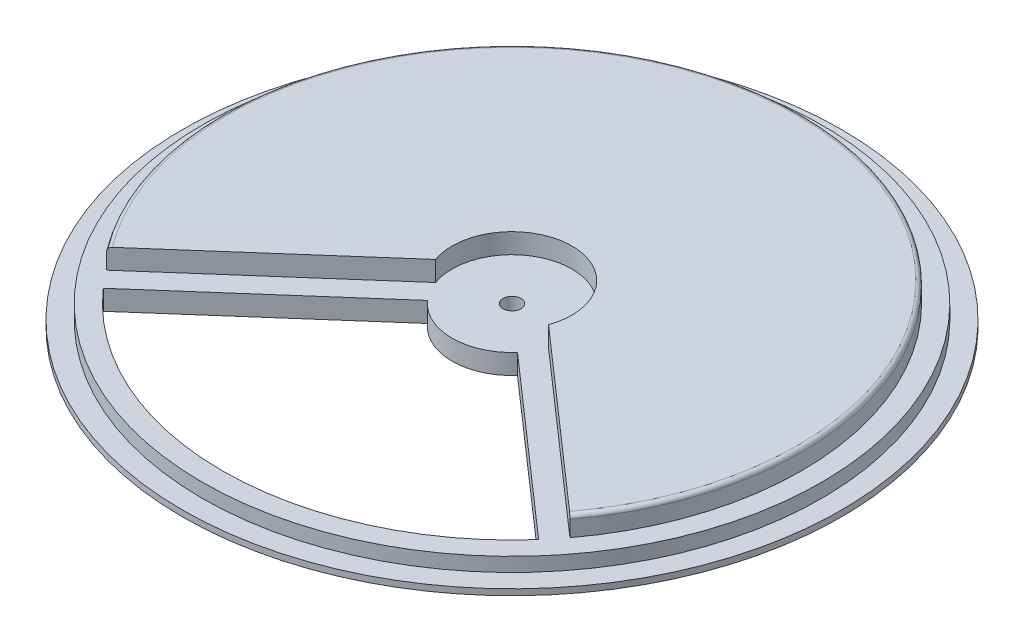
ISO-10303-21;
HEADER;
FILE_DESCRIPTION(('STEP AP214'),'2;1');
FILE_NAME('part.step','',(''),(''),'','','');
FILE_SCHEMA(('AUTOMOTIVE_DESIGN { 1 0 10303 214 1 1 1 1 }'));
ENDSEC;
DATA;
#1=APPLICATION_CONTEXT('core data for automotive mechanical design processes');
#2=APPLICATION_PROTOCOL_DEFINITION('international standard','automotive_design',2000,#1);
#3=PRODUCT_CONTEXT('',#1,'mechanical');
#4=PRODUCT('Part','Part','',(#3));
#5=PRODUCT_RELATED_PRODUCT_CATEGORY('part','',(#4));
#6=PRODUCT_DEFINITION_FORMATION('','',#4);
#7=PRODUCT_DEFINITION_CONTEXT('part definition',#1,'design');
#8=PRODUCT_DEFINITION('design','',#6,#7);
#9=PRODUCT_DEFINITION_SHAPE('','',#8);
#10=(LENGTH_UNIT() NAMED_UNIT(*) SI_UNIT(.MILLI.,.METRE.));
#11=(NAMED_UNIT(*) PLANE_ANGLE_UNIT() SI_UNIT($,.RADIAN.));
#12=(NAMED_UNIT(*) SI_UNIT($,.STERADIAN.) SOLID_ANGLE_UNIT());
#13=UNCERTAINTY_MEASURE_WITH_UNIT(LENGTH_MEASURE(1.E-05),#10,'distance_accuracy_value','');
#14=(GEOMETRIC_REPRESENTATION_CONTEXT(3) GLOBAL_UNCERTAINTY_ASSIGNED_CONTEXT((#13)) GLOBAL_UNIT_ASSIGNED_CONTEXT((#10,
#11,#12)) REPRESENTATION_CONTEXT('',''));
#15=CARTESIAN_POINT('',(0.,0.,0.));
#16=DIRECTION('',(0.,0.,1.));
#17=DIRECTION('',(1.,0.,0.));
#18=AXIS2_PLACEMENT_3D('',#15,#16,#17);
#19=CARTESIAN_POINT('',(0.,3.81,0.));
#20=DIRECTION('',(0.,-1.,0.));
#21=DIRECTION('',(0.,0.,-1.));
#22=AXIS2_PLACEMENT_3D('',#19,#20,#21);
#23=CYLINDRICAL_SURFACE('',#22,209.55);
#24=CARTESIAN_POINT('',(0.,3.81,0.));
#25=DIRECTION('',(0.,1.,0.));
#26=DIRECTION('',(0.,0.,1.));
#27=AXIS2_PLACEMENT_3D('',#24,#25,#26);
#28=CIRCLE('',#27,209.55);
#29=CARTESIAN_POINT('',(0.,3.81,-209.55));
#30=VERTEX_POINT('',#29);
#31=EDGE_CURVE('E115',#30,#30,#28,.T.);
#32=CARTESIAN_POINT('',(0.,0.,0.));
#33=DIRECTION('',(0.,1.,0.));
#34=DIRECTION('',(0.,0.,1.));
#35=AXIS2_PLACEMENT_3D('',#32,#33,#34);
#36=CIRCLE('',#35,209.55);
#37=CARTESIAN_POINT('',(0.,0.,-209.55));
#38=VERTEX_POINT('',#37);
#39=EDGE_CURVE('E373',#38,#38,#36,.T.);
#40=CARTESIAN_POINT('',(0.,3.81,-209.55));
#41=CARTESIAN_POINT('',(0.,3.7703125,-209.55));
#42=CARTESIAN_POINT('',(0.,3.730625,-209.55));
#43=CARTESIAN_POINT('',(0.,3.65125,-209.55));
#44=CARTESIAN_POINT('',(0.,3.6115625,-209.55));
#45=CARTESIAN_POINT('',(0.,3.5321875,-209.55));
#46=CARTESIAN_POINT('',(0.,3.4925,-209.55));
#47=CARTESIAN_POINT('',(0.,3.413125,-209.55));
#48=CARTESIAN_POINT('',(0.,3.3734375,-209.55));
#49=CARTESIAN_POINT('',(0.,3.2940625,-209.55));
#50=CARTESIAN_POINT('',(0.,3.254375,-209.55));
#51=CARTESIAN_POINT('',(0.,3.175,-209.55));
#52=CARTESIAN_POINT('',(0.,3.1353125,-209.55));
#53=CARTESIAN_POINT('',(0.,3.0559375,-209.55));
#54=CARTESIAN_POINT('',(0.,3.01625,-209.55));
#55=CARTESIAN_POINT('',(0.,2.936875,-209.55));
#56=CARTESIAN_POINT('',(0.,2.8971875,-209.55));
#57=CARTESIAN_POINT('',(0.,2.8178125,-209.55));
#58=CARTESIAN_POINT('',(0.,2.778125,-209.55));
#59=CARTESIAN_POINT('',(0.,2.69875,-209.55));
#60=CARTESIAN_POINT('',(0.,2.6590625,-209.55));
#61=CARTESIAN_POINT('',(0.,2.5796875,-209.55));
#62=CARTESIAN_POINT('',(0.,2.54,-209.55));
#63=CARTESIAN_POINT('',(0.,2.460625,-209.55));
#64=CARTESIAN_POINT('',(0.,2.4209375,-209.55));
#65=CARTESIAN_POINT('',(0.,2.3415625,-209.55));
#66=CARTESIAN_POINT('',(0.,2.301875,-209.55));
#67=CARTESIAN_POINT('',(0.,2.2225,-209.55));
#68=CARTESIAN_POINT('',(0.,2.1828125,-209.55));
#69=CARTESIAN_POINT('',(0.,2.1034375,-209.55));
#70=CARTESIAN_POINT('',(0.,2.06375,-209.55));
#71=CARTESIAN_POINT('',(0.,1.984375,-209.55));
#72=CARTESIAN_POINT('',(0.,1.9446875,-209.55));
#73=CARTESIAN_POINT('',(0.,1.8653125,-209.55));
#74=CARTESIAN_POINT('',(0.,1.825625,-209.55));
#75=CARTESIAN_POINT('',(0.,1.74625,-209.55));
#76=CARTESIAN_POINT('',(0.,1.7065625,-209.55));
#77=CARTESIAN_POINT('',(0.,1.6271875,-209.55));
#78=CARTESIAN_POINT('',(0.,1.5875,-209.55));
#79=CARTESIAN_POINT('',(0.,1.508125,-209.55));
#80=CARTESIAN_POINT('',(0.,1.4684375,-209.55));
#81=CARTESIAN_POINT('',(0.,1.3890625,-209.55));
#82=CARTESIAN_POINT('',(0.,1.349375,-209.55));
#83=CARTESIAN_POINT('',(0.,1.27,-209.55));
#84=CARTESIAN_POINT('',(0.,1.2303125,-209.55));
#85=CARTESIAN_POINT('',(0.,1.1509375,-209.55));
#86=CARTESIAN_POINT('',(0.,1.11125,-209.55));
#87=CARTESIAN_POINT('',(0.,1.031875,-209.55));
#88=CARTESIAN_POINT('',(0.,0.9921875,-209.55));
#89=CARTESIAN_POINT('',(0.,0.9128125,-209.55));
#90=CARTESIAN_POINT('',(0.,0.873125,-209.55));
#91=CARTESIAN_POINT('',(0.,0.79375,-209.55));
#92=CARTESIAN_POINT('',(0.,0.7540625,-209.55));
#93=CARTESIAN_POINT('',(0.,0.6746875,-209.55));
#94=CARTESIAN_POINT('',(0.,0.635,-209.55));
#95=CARTESIAN_POINT('',(0.,0.555625,-209.55));
#96=CARTESIAN_POINT('',(0.,0.5159375,-209.55));
#97=CARTESIAN_POINT('',(0.,0.4365625,-209.55));
#98=CARTESIAN_POINT('',(0.,0.396875,-209.55));
#99=CARTESIAN_POINT('',(0.,0.3175,-209.55));
#100=CARTESIAN_POINT('',(0.,0.2778125,-209.55));
#101=CARTESIAN_POINT('',(0.,0.1984375,-209.55));
#102=CARTESIAN_POINT('',(0.,0.15875,-209.55));
#103=CARTESIAN_POINT('',(0.,0.0793749999999999,-209.55));
#104=CARTESIAN_POINT('',(0.,0.0396874999999999,-209.55));
#105=CARTESIAN_POINT('',(0.,0.,-209.55));
#106=B_SPLINE_CURVE_WITH_KNOTS('',3,(#40,#41,#42,#43,#44,#45,#46,#47,#48,#49,#50,#51,#52,#53,
#54,#55,#56,#57,#58,#59,#60,#61,#62,#63,#64,#65,#66,#67,#68,#69,#70,#71,#72,#73,#74,#75,#76,#77,
#78,#79,#80,#81,#82,#83,#84,#85,#86,#87,#88,#89,#90,#91,#92,#93,#94,#95,#96,#97,#98,#99,#100,
#101,#102,#103,#104,#105),.UNSPECIFIED.,.F.,.F.,(4,2,2,2,2,2,2,2,2,2,2,2,2,2,2,2,2,2,2,2,2,2,2,
2,2,2,2,2,2,2,2,2,4),(0.,0.1190625,0.238125,0.3571875,0.47625,0.5953125,0.714375,0.8334375,
0.9525,1.0715625,1.190625,1.3096875,1.42875,1.5478125,1.666875,1.7859375,1.905,2.0240625,
2.143125,2.2621875,2.38125,2.5003125,2.619375,2.7384375,2.8575,2.9765625,3.095625,3.2146875,
3.33375,3.4528125,3.571875,3.6909375,3.81),.UNSPECIFIED.);
#107=EDGE_CURVE('BSEAM52',#30,#38,#106,.T.);
#108=ORIENTED_EDGE('',*,*,#31,.F.);
#109=ORIENTED_EDGE('',*,*,#39,.T.);
#110=ORIENTED_EDGE('',*,*,#107,.T.);
#111=ORIENTED_EDGE('',*,*,#107,.F.);
#112=EDGE_LOOP('',(#108,#110,#109,#111));
#113=FACE_BOUND('',#112,.T.);
#114=ADVANCED_FACE('F52',(#113),#23,.T.);
#115=CARTESIAN_POINT('',(0.,3.81,0.));
#116=DIRECTION('',(0.,1.,0.));
#117=DIRECTION('',(0.,0.,1.));
#118=AXIS2_PLACEMENT_3D('',#115,#116,#117);
#119=PLANE('',#118);
#120=CARTESIAN_POINT('',(0.,3.81,0.));
#121=DIRECTION('',(0.,1.,0.));
#122=DIRECTION('',(0.,0.,1.));
#123=AXIS2_PLACEMENT_3D('',#120,#121,#122);
#124=CIRCLE('',#123,196.85);
#125=CARTESIAN_POINT('',(0.,3.81,196.85));
#126=VERTEX_POINT('',#125);
#127=EDGE_CURVE('E128',#126,#126,#124,.T.);
#128=ORIENTED_EDGE('',*,*,#127,.F.);
#129=EDGE_LOOP('',(#128));
#130=FACE_BOUND('',#129,.T.);
#131=ORIENTED_EDGE('',*,*,#31,.T.);
#132=EDGE_LOOP('',(#131));
#133=FACE_BOUND('',#132,.T.);
#134=ADVANCED_FACE('F219',(#130,#133),#119,.T.);
#135=CARTESIAN_POINT('',(0.,0.,0.));
#136=DIRECTION('',(0.,1.,0.));
#137=DIRECTION('',(0.,0.,1.));
#138=AXIS2_PLACEMENT_3D('',#135,#136,#137);
#139=PLANE('',#138);
#140=DIRECTION('',(-0.751519606456444,0.,0.659710755643374));
#141=VECTOR('',#140,1.);
#142=CARTESIAN_POINT('',(-138.392335528954,0.,121.485735651727));
#143=LINE('',#142,#141);
#144=CARTESIAN_POINT('',(-28.6328970059905,0.,25.1349797900126));
#145=VERTEX_POINT('',#144);
#146=CARTESIAN_POINT('',(-138.392335528954,0.,121.485735651727));
#147=VERTEX_POINT('',#146);
#148=EDGE_CURVE('E92',#145,#147,#143,.T.);
#149=ORIENTED_EDGE('',*,*,#148,.T.);
#150=CARTESIAN_POINT('',(0.,0.,0.));
#151=DIRECTION('',(0.,1.,0.));
#152=DIRECTION('',(0.,0.,1.));
#153=AXIS2_PLACEMENT_3D('',#150,#151,#152);
#154=CIRCLE('',#153,184.15);
#155=CARTESIAN_POINT('',(138.392335528954,0.,121.485735651727));
#156=VERTEX_POINT('',#155);
#157=EDGE_CURVE('E114',#147,#156,#154,.T.);
#158=ORIENTED_EDGE('',*,*,#157,.T.);
#159=DIRECTION('',(-0.751519606456444,0.,-0.659710755643375));
#160=VECTOR('',#159,1.);
#161=CARTESIAN_POINT('',(28.6328970059905,0.,25.1349797900126));
#162=LINE('',#161,#160);
#163=CARTESIAN_POINT('',(28.6328970059905,0.,25.1349797900126));
#164=VERTEX_POINT('',#163);
#165=EDGE_CURVE('E119',#156,#164,#162,.T.);
#166=ORIENTED_EDGE('',*,*,#165,.T.);
#167=CARTESIAN_POINT('',(0.,0.,0.));
#168=DIRECTION('',(0.,-1.,0.));
#169=DIRECTION('',(0.,0.,1.));
#170=AXIS2_PLACEMENT_3D('',#167,#168,#169);
#171=CIRCLE('',#170,38.1);
#172=EDGE_CURVE('E116',#164,#145,#171,.T.);
#173=ORIENTED_EDGE('',*,*,#172,.T.);
#174=EDGE_LOOP('',(#149,#158,#166,#173));
#175=FACE_BOUND('',#174,.T.);
#176=DIRECTION('',(0.751519606456444,0.,0.659710755643374));
#177=VECTOR('',#176,1.);
#178=CARTESIAN_POINT('',(147.32,0.,110.49));
#179=LINE('',#178,#177);
#180=CARTESIAN_POINT('',(35.9210244842766,0.,12.7));
#181=VERTEX_POINT('',#180);
#182=CARTESIAN_POINT('',(147.32,0.,110.49));
#183=VERTEX_POINT('',#182);
#184=EDGE_CURVE('E118',#181,#183,#179,.T.);
#185=ORIENTED_EDGE('',*,*,#184,.T.);
#186=CARTESIAN_POINT('',(0.,0.,0.));
#187=DIRECTION('',(0.,1.,0.));
#188=DIRECTION('',(0.,0.,1.));
#189=AXIS2_PLACEMENT_3D('',#186,#187,#188);
#190=CIRCLE('',#189,184.15);
#191=CARTESIAN_POINT('',(-147.32,0.,110.49));
#192=VERTEX_POINT('',#191);
#193=EDGE_CURVE('E156',#183,#192,#190,.T.);
#194=ORIENTED_EDGE('',*,*,#193,.T.);
#195=DIRECTION('',(0.751519606456444,0.,-0.659710755643374));
#196=VECTOR('',#195,1.);
#197=CARTESIAN_POINT('',(-147.32,0.,110.49));
#198=LINE('',#197,#196);
#199=CARTESIAN_POINT('',(-35.9210244842766,0.,12.7));
#200=VERTEX_POINT('',#199);
#201=EDGE_CURVE('E161',#192,#200,#198,.T.);
#202=ORIENTED_EDGE('',*,*,#201,.T.);
#203=CARTESIAN_POINT('',(0.,0.,0.));
#204=DIRECTION('',(0.,-1.,0.));
#205=DIRECTION('',(0.,0.,1.));
#206=AXIS2_PLACEMENT_3D('',#203,#204,#205);
#207=CIRCLE('',#206,38.1);
#208=EDGE_CURVE('E157',#200,#181,#207,.T.);
#209=ORIENTED_EDGE('',*,*,#208,.T.);
#210=EDGE_LOOP('',(#185,#194,#202,#209));
#211=FACE_BOUND('',#210,.T.);
#212=CARTESIAN_POINT('',(0.,0.,0.));
#213=DIRECTION('',(0.,1.,0.));
#214=DIRECTION('',(0.,0.,1.));
#215=AXIS2_PLACEMENT_3D('',#212,#213,#214);
#216=CIRCLE('',#215,5.715);
#217=CARTESIAN_POINT('',(0.,0.,5.715));
#218=VERTEX_POINT('',#217);
#219=EDGE_CURVE('E160',#218,#218,#216,.T.);
#220=ORIENTED_EDGE('',*,*,#219,.T.);
#221=EDGE_LOOP('',(#220));
#222=FACE_BOUND('',#221,.T.);
#223=ORIENTED_EDGE('',*,*,#39,.F.);
#224=EDGE_LOOP('',(#223));
#225=FACE_BOUND('',#224,.T.);
#226=ADVANCED_FACE('F169',(#175,#211,#222,#225),#139,.F.);
#227=CARTESIAN_POINT('',(0.,12.7,0.));
#228=DIRECTION('',(0.,-1.,0.));
#229=DIRECTION('',(0.,0.,-1.));
#230=AXIS2_PLACEMENT_3D('',#227,#228,#229);
#231=CYLINDRICAL_SURFACE('',#230,196.85);
#232=CARTESIAN_POINT('',(0.,12.7,0.));
#233=DIRECTION('',(0.,1.,0.));
#234=DIRECTION('',(0.,0.,1.));
#235=AXIS2_PLACEMENT_3D('',#232,#233,#234);
#236=CIRCLE('',#235,196.85);
#237=CARTESIAN_POINT('',(0.,12.7,196.85));
#238=VERTEX_POINT('',#237);
#239=EDGE_CURVE('E130',#238,#238,#236,.T.);
#240=ORIENTED_EDGE('',*,*,#239,.F.);
#241=EDGE_LOOP('',(#240));
#242=FACE_BOUND('',#241,.T.);
#243=ORIENTED_EDGE('',*,*,#127,.T.);
#244=EDGE_LOOP('',(#243));
#245=FACE_BOUND('',#244,.T.);
#246=ADVANCED_FACE('F231',(#242,#245),#231,.T.);
#247=CARTESIAN_POINT('',(0.,12.7,0.));
#248=DIRECTION('',(0.,1.,0.));
#249=DIRECTION('',(0.,0.,1.));
#250=AXIS2_PLACEMENT_3D('',#247,#248,#249);
#251=PLANE('',#250);
#252=CARTESIAN_POINT('',(0.,12.7,0.));
#253=DIRECTION('',(0.,1.,0.));
#254=DIRECTION('',(0.,0.,1.));
#255=AXIS2_PLACEMENT_3D('',#252,#253,#254);
#256=CIRCLE('',#255,184.15);
#257=CARTESIAN_POINT('',(-138.392335528954,12.7,121.485735651727));
#258=VERTEX_POINT('',#257);
#259=CARTESIAN_POINT('',(138.392335528954,12.7,121.485735651727));
#260=VERTEX_POINT('',#259);
#261=EDGE_CURVE('E104',#258,#260,#256,.T.);
#262=ORIENTED_EDGE('',*,*,#261,.F.);
#263=DIRECTION('',(-0.751519606456444,0.,0.659710755643374));
#264=VECTOR('',#263,1.);
#265=CARTESIAN_POINT('',(-138.392335528954,12.7,121.485735651727));
#266=LINE('',#265,#264);
#267=CARTESIAN_POINT('',(-28.6328970059905,12.7,25.1349797900126));
#268=VERTEX_POINT('',#267);
#269=EDGE_CURVE('E89',#268,#258,#266,.T.);
#270=ORIENTED_EDGE('',*,*,#269,.F.);
#271=CARTESIAN_POINT('',(0.,12.7,0.));
#272=DIRECTION('',(0.,-1.,0.));
#273=DIRECTION('',(0.,0.,1.));
#274=AXIS2_PLACEMENT_3D('',#271,#272,#273);
#275=CIRCLE('',#274,38.1);
#276=CARTESIAN_POINT('',(28.6328970059905,12.7,25.1349797900126));
#277=VERTEX_POINT('',#276);
#278=EDGE_CURVE('E94',#277,#268,#275,.T.);
#279=ORIENTED_EDGE('',*,*,#278,.F.);
#280=DIRECTION('',(-0.751519606456444,0.,-0.659710755643375));
#281=VECTOR('',#280,1.);
#282=CARTESIAN_POINT('',(28.6328970059905,12.7,25.1349797900126));
#283=LINE('',#282,#281);
#284=EDGE_CURVE('E62',#260,#277,#283,.T.);
#285=ORIENTED_EDGE('',*,*,#284,.F.);
#286=EDGE_LOOP('',(#262,#270,#279,#285));
#287=FACE_BOUND('',#286,.T.);
#288=CARTESIAN_POINT('',(0.,12.7,0.));
#289=DIRECTION('',(0.,1.,0.));
#290=DIRECTION('',(0.,0.,1.));
#291=AXIS2_PLACEMENT_3D('',#288,#289,#290);
#292=CIRCLE('',#291,184.15);
#293=CARTESIAN_POINT('',(147.32,12.7,110.49));
#294=VERTEX_POINT('',#293);
#295=CARTESIAN_POINT('',(-147.32,12.7,110.49));
#296=VERTEX_POINT('',#295);
#297=EDGE_CURVE('E56',#294,#296,#292,.T.);
#298=ORIENTED_EDGE('',*,*,#297,.F.);
#299=DIRECTION('',(-0.751519606456444,0.,-0.659710755643374));
#300=VECTOR('',#299,1.);
#301=CARTESIAN_POINT('',(147.32,12.7,110.49));
#302=LINE('',#301,#300);
#303=CARTESIAN_POINT('',(35.9210244842766,12.7,12.7));
#304=VERTEX_POINT('',#303);
#305=EDGE_CURVE('E124',#294,#304,#302,.T.);
#306=ORIENTED_EDGE('',*,*,#305,.T.);
#307=CARTESIAN_POINT('',(0.,12.7,0.));
#308=DIRECTION('',(0.,1.,0.));
#309=DIRECTION('',(0.,0.,1.));
#310=AXIS2_PLACEMENT_3D('',#307,#308,#309);
#311=CIRCLE('',#310,38.1);
#312=CARTESIAN_POINT('',(-35.9210244842766,12.7,12.7));
#313=VERTEX_POINT('',#312);
#314=EDGE_CURVE('E127',#304,#313,#311,.T.);
#315=ORIENTED_EDGE('',*,*,#314,.T.);
#316=DIRECTION('',(0.751519606456444,0.,-0.659710755643374));
#317=VECTOR('',#316,1.);
#318=CARTESIAN_POINT('',(-147.32,12.7,110.49));
#319=LINE('',#318,#317);
#320=EDGE_CURVE('E131',#296,#313,#319,.T.);
#321=ORIENTED_EDGE('',*,*,#320,.F.);
#322=EDGE_LOOP('',(#298,#306,#315,#321));
#323=FACE_BOUND('',#322,.T.);
#324=CARTESIAN_POINT('',(0.,12.7,0.));
#325=DIRECTION('',(0.,1.,0.));
#326=DIRECTION('',(0.,0.,1.));
#327=AXIS2_PLACEMENT_3D('',#324,#325,#326);
#328=CIRCLE('',#327,5.715);
#329=CARTESIAN_POINT('',(0.,12.7,5.715));
#330=VERTEX_POINT('',#329);
#331=EDGE_CURVE('E148',#330,#330,#328,.T.);
#332=ORIENTED_EDGE('',*,*,#331,.F.);
#333=EDGE_LOOP('',(#332));
#334=FACE_BOUND('',#333,.T.);
#335=ORIENTED_EDGE('',*,*,#239,.T.);
#336=EDGE_LOOP('',(#335));
#337=FACE_BOUND('',#336,.T.);
#338=ADVANCED_FACE('F101',(#287,#323,#334,#337),#251,.T.);
#339=CARTESIAN_POINT('',(0.,0.,0.));
#340=DIRECTION('',(0.,1.,0.));
#341=DIRECTION('',(0.,0.,1.));
#342=AXIS2_PLACEMENT_3D('',#339,#340,#341);
#343=CYLINDRICAL_SURFACE('',#342,5.715);
#344=ORIENTED_EDGE('',*,*,#219,.F.);
#345=EDGE_LOOP('',(#344));
#346=FACE_BOUND('',#345,.T.);
#347=ORIENTED_EDGE('',*,*,#331,.T.);
#348=EDGE_LOOP('',(#347));
#349=FACE_BOUND('',#348,.T.);
#350=ADVANCED_FACE('F207',(#346,#349),#343,.F.);
#351=CARTESIAN_POINT('',(147.32,0.,110.49));
#352=DIRECTION('',(-0.659710755643374,0.,0.751519606456444));
#353=DIRECTION('',(0.751519606456444,0.,0.659710755643374));
#354=AXIS2_PLACEMENT_3D('',#351,#352,#353);
#355=PLANE('',#354);
#356=ORIENTED_EDGE('',*,*,#305,.F.);
#357=DIRECTION('',(0.,1.,0.));
#358=VECTOR('',#357,1.);
#359=CARTESIAN_POINT('',(147.32,0.,110.49));
#360=LINE('',#359,#358);
#361=EDGE_CURVE('E112',#183,#294,#360,.T.);
#362=ORIENTED_EDGE('',*,*,#361,.F.);
#363=ORIENTED_EDGE('',*,*,#184,.F.);
#364=DIRECTION('',(0.,1.,0.));
#365=VECTOR('',#364,1.);
#366=CARTESIAN_POINT('',(35.9210244842766,0.,12.7));
#367=LINE('',#366,#365);
#368=EDGE_CURVE('E142',#181,#304,#367,.T.);
#369=ORIENTED_EDGE('',*,*,#368,.T.);
#370=EDGE_LOOP('',(#356,#362,#363,#369));
#371=FACE_BOUND('',#370,.T.);
#372=ADVANCED_FACE('F205',(#371),#355,.F.);
#373=CARTESIAN_POINT('',(0.,0.,0.));
#374=DIRECTION('',(0.,1.,0.));
#375=DIRECTION('',(0.,0.,1.));
#376=AXIS2_PLACEMENT_3D('',#373,#374,#375);
#377=CYLINDRICAL_SURFACE('',#376,38.1);
#378=ORIENTED_EDGE('',*,*,#314,.F.);
#379=ORIENTED_EDGE('',*,*,#368,.F.);
#380=ORIENTED_EDGE('',*,*,#208,.F.);
#381=DIRECTION('',(0.,1.,0.));
#382=VECTOR('',#381,1.);
#383=CARTESIAN_POINT('',(-35.9210244842766,0.,12.7));
#384=LINE('',#383,#382);
#385=EDGE_CURVE('E134',#200,#313,#384,.T.);
#386=ORIENTED_EDGE('',*,*,#385,.T.);
#387=EDGE_LOOP('',(#378,#379,#380,#386));
#388=FACE_BOUND('',#387,.T.);
#389=ADVANCED_FACE('F204',(#388),#377,.T.);
#390=CARTESIAN_POINT('',(-147.32,0.,110.49));
#391=DIRECTION('',(0.659710755643374,0.,0.751519606456444));
#392=DIRECTION('',(0.751519606456444,0.,-0.659710755643374));
#393=AXIS2_PLACEMENT_3D('',#390,#391,#392);
#394=PLANE('',#393);
#395=ORIENTED_EDGE('',*,*,#320,.T.);
#396=ORIENTED_EDGE('',*,*,#385,.F.);
#397=ORIENTED_EDGE('',*,*,#201,.F.);
#398=DIRECTION('',(0.,1.,0.));
#399=VECTOR('',#398,1.);
#400=CARTESIAN_POINT('',(-147.32,0.,110.49));
#401=LINE('',#400,#399);
#402=EDGE_CURVE('E133',#192,#296,#401,.T.);
#403=ORIENTED_EDGE('',*,*,#402,.T.);
#404=EDGE_LOOP('',(#395,#396,#397,#403));
#405=FACE_BOUND('',#404,.T.);
#406=ADVANCED_FACE('F202',(#405),#394,.F.);
#407=CARTESIAN_POINT('',(0.,0.,0.));
#408=DIRECTION('',(0.,1.,0.));
#409=DIRECTION('',(0.,0.,1.));
#410=AXIS2_PLACEMENT_3D('',#407,#408,#409);
#411=CYLINDRICAL_SURFACE('',#410,184.15);
#412=ORIENTED_EDGE('',*,*,#297,.T.);
#413=ORIENTED_EDGE('',*,*,#402,.F.);
#414=ORIENTED_EDGE('',*,*,#193,.F.);
#415=ORIENTED_EDGE('',*,*,#361,.T.);
#416=EDGE_LOOP('',(#412,#413,#414,#415));
#417=FACE_BOUND('',#416,.T.);
#418=ADVANCED_FACE('F181',(#417),#411,.F.);
#419=CARTESIAN_POINT('',(0.,0.,0.));
#420=DIRECTION('',(0.,1.,0.));
#421=DIRECTION('',(0.,0.,1.));
#422=AXIS2_PLACEMENT_3D('',#419,#420,#421);
#423=CYLINDRICAL_SURFACE('',#422,184.15);
#424=ORIENTED_EDGE('',*,*,#261,.T.);
#425=DIRECTION('',(0.,1.,0.));
#426=VECTOR('',#425,1.);
#427=CARTESIAN_POINT('',(138.392335528954,0.,121.485735651727));
#428=LINE('',#427,#426);
#429=EDGE_CURVE('E12',#156,#260,#428,.T.);
#430=ORIENTED_EDGE('',*,*,#429,.F.);
#431=ORIENTED_EDGE('',*,*,#157,.F.);
#432=DIRECTION('',(0.,1.,0.));
#433=VECTOR('',#432,1.);
#434=CARTESIAN_POINT('',(-138.392335528954,0.,121.485735651727));
#435=LINE('',#434,#433);
#436=EDGE_CURVE('E105',#147,#258,#435,.T.);
#437=ORIENTED_EDGE('',*,*,#436,.T.);
#438=EDGE_LOOP('',(#424,#430,#431,#437));
#439=FACE_BOUND('',#438,.T.);
#440=ADVANCED_FACE('F241',(#439),#423,.F.);
#441=CARTESIAN_POINT('',(-138.392335528954,0.,121.485735651727));
#442=DIRECTION('',(-0.659710755643374,0.,-0.751519606456444));
#443=DIRECTION('',(-0.751519606456444,0.,0.659710755643374));
#444=AXIS2_PLACEMENT_3D('',#441,#442,#443);
#445=PLANE('',#444);
#446=ORIENTED_EDGE('',*,*,#269,.T.);
#447=ORIENTED_EDGE('',*,*,#436,.F.);
#448=ORIENTED_EDGE('',*,*,#148,.F.);
#449=DIRECTION('',(0.,1.,0.));
#450=VECTOR('',#449,1.);
#451=CARTESIAN_POINT('',(-28.6328970059905,0.,25.1349797900126));
#452=LINE('',#451,#450);
#453=EDGE_CURVE('E84',#145,#268,#452,.T.);
#454=ORIENTED_EDGE('',*,*,#453,.T.);
#455=EDGE_LOOP('',(#446,#447,#448,#454));
#456=FACE_BOUND('',#455,.T.);
#457=ADVANCED_FACE('F54',(#456),#445,.F.);
#458=CARTESIAN_POINT('',(0.,0.,0.));
#459=DIRECTION('',(0.,1.,0.));
#460=DIRECTION('',(0.,0.,1.));
#461=AXIS2_PLACEMENT_3D('',#458,#459,#460);
#462=CYLINDRICAL_SURFACE('',#461,38.1);
#463=ORIENTED_EDGE('',*,*,#278,.T.);
#464=ORIENTED_EDGE('',*,*,#453,.F.);
#465=ORIENTED_EDGE('',*,*,#172,.F.);
#466=DIRECTION('',(0.,1.,0.));
#467=VECTOR('',#466,1.);
#468=CARTESIAN_POINT('',(28.6328970059905,0.,25.1349797900126));
#469=LINE('',#468,#467);
#470=EDGE_CURVE('E71',#164,#277,#469,.T.);
#471=ORIENTED_EDGE('',*,*,#470,.T.);
#472=EDGE_LOOP('',(#463,#464,#465,#471));
#473=FACE_BOUND('',#472,.T.);
#474=ADVANCED_FACE('F97',(#473),#462,.T.);
#475=CARTESIAN_POINT('',(28.6328970059905,0.,25.1349797900126));
#476=DIRECTION('',(0.659710755643374,0.,-0.751519606456444));
#477=DIRECTION('',(-0.751519606456444,0.,-0.659710755643375));
#478=AXIS2_PLACEMENT_3D('',#475,#476,#477);
#479=PLANE('',#478);
#480=ORIENTED_EDGE('',*,*,#284,.T.);
#481=ORIENTED_EDGE('',*,*,#470,.F.);
#482=ORIENTED_EDGE('',*,*,#165,.F.);
#483=ORIENTED_EDGE('',*,*,#429,.T.);
#484=EDGE_LOOP('',(#480,#481,#482,#483));
#485=FACE_BOUND('',#484,.T.);
#486=ADVANCED_FACE('F267',(#485),#479,.F.);
#487=CLOSED_SHELL('',(#114,#134,#226,#246,#338,#350,#372,#389,#406,#418,#440,#457,#474,#486));
#488=MANIFOLD_SOLID_BREP('B2',#487);
#489=CARTESIAN_POINT('',(0.,25.4,0.));
#490=DIRECTION('',(0.,1.,0.));
#491=DIRECTION('',(0.,0.,1.));
#492=AXIS2_PLACEMENT_3D('',#489,#490,#491);
#493=PLANE('',#492);
#494=DIRECTION('',(-0.751519606456444,0.,-0.659710755643374));
#495=VECTOR('',#494,1.);
#496=CARTESIAN_POINT('',(147.32,25.4,110.49));
#497=LINE('',#496,#495);
#498=CARTESIAN_POINT('',(145.405397746009,25.4,108.809293749776));
#499=VERTEX_POINT('',#498);
#500=CARTESIAN_POINT('',(35.9210244842766,25.4,12.7));
#501=VERTEX_POINT('',#500);
#502=EDGE_CURVE('E456',#499,#501,#497,.T.);
#503=ORIENTED_EDGE('',*,*,#502,.F.);
#504=CARTESIAN_POINT('',(0.,25.4,0.));
#505=DIRECTION('',(0.,1.,0.));
#506=DIRECTION('',(0.,0.,1.));
#507=AXIS2_PLACEMENT_3D('',#504,#505,#506);
#508=CIRCLE('',#507,181.61);
#509=CARTESIAN_POINT('',(-145.405397746009,25.4,108.809293749776));
#510=VERTEX_POINT('',#509);
#511=EDGE_CURVE('E464',#499,#510,#508,.T.);
#512=ORIENTED_EDGE('',*,*,#511,.T.);
#513=DIRECTION('',(0.751519606456444,0.,-0.659710755643374));
#514=VECTOR('',#513,1.);
#515=CARTESIAN_POINT('',(-147.32,25.4,110.49));
#516=LINE('',#515,#514);
#517=CARTESIAN_POINT('',(-35.9210244842766,25.4,12.7));
#518=VERTEX_POINT('',#517);
#519=EDGE_CURVE('E461',#510,#518,#516,.T.);
#520=ORIENTED_EDGE('',*,*,#519,.T.);
#521=CARTESIAN_POINT('',(0.,25.4,0.));
#522=DIRECTION('',(0.,1.,0.));
#523=DIRECTION('',(0.,0.,1.));
#524=AXIS2_PLACEMENT_3D('',#521,#522,#523);
#525=CIRCLE('',#524,38.1);
#526=EDGE_CURVE('E506',#501,#518,#525,.T.);
#527=ORIENTED_EDGE('',*,*,#526,.F.);
#528=EDGE_LOOP('',(#503,#512,#520,#527));
#529=FACE_BOUND('',#528,.T.);
#530=ADVANCED_FACE('F381',(#529),#493,.T.);
#531=CARTESIAN_POINT('',(147.32,25.4,110.49));
#532=DIRECTION('',(-0.659710755643374,0.,0.751519606456444));
#533=DIRECTION('',(0.751519606456444,0.,0.659710755643374));
#534=AXIS2_PLACEMENT_3D('',#531,#532,#533);
#535=PLANE('',#534);
#536=DIRECTION('',(0.,-1.,0.));
#537=VECTOR('',#536,1.);
#538=CARTESIAN_POINT('',(147.32,25.4,110.49));
#539=LINE('',#538,#537);
#540=CARTESIAN_POINT('',(147.32,22.86,110.49));
#541=VERTEX_POINT('',#540);
#542=CARTESIAN_POINT('',(147.32,12.7,110.49));
#543=VERTEX_POINT('',#542);
#544=EDGE_CURVE('E452',#541,#543,#539,.T.);
#545=ORIENTED_EDGE('',*,*,#544,.F.);
#546=CARTESIAN_POINT('',(147.32,22.86,110.49));
#547=CARTESIAN_POINT('',(147.32000524362,22.9312874188685,110.490004603037));
#548=CARTESIAN_POINT('',(147.317737932438,23.0025715283599,110.488014276291));
#549=CARTESIAN_POINT('',(147.308698758001,23.1446285536486,110.48007936608));
#550=CARTESIAN_POINT('',(147.301927137087,23.2154014967406,110.474134995353));
#551=CARTESIAN_POINT('',(147.283927439081,23.3558804955181,110.458334217474));
#552=CARTESIAN_POINT('',(147.272703101979,23.4255873957089,110.44848109342));
#553=CARTESIAN_POINT('',(147.245890421347,23.5634780229109,110.424943964584));
#554=CARTESIAN_POINT('',(147.230302126238,23.6316617668128,110.411260002306));
#555=CARTESIAN_POINT('',(147.177120950236,23.8332669737115,110.364575666323));
#556=CARTESIAN_POINT('',(147.133103871122,23.963803774977,110.325935901938));
#557=CARTESIAN_POINT('',(147.029273959883,24.2131149596221,110.234790296935));
#558=CARTESIAN_POINT('',(146.969463539828,24.3318911353619,110.182286573718));
#559=CARTESIAN_POINT('',(146.835652063476,24.5546046627676,110.064822079885));
#560=CARTESIAN_POINT('',(146.761632839295,24.6585227162421,109.999845360852));
#561=CARTESIAN_POINT('',(146.601551194304,24.8484195997271,109.859319974589));
#562=CARTESIAN_POINT('',(146.515486358536,24.9343948238475,109.783769187423));
#563=CARTESIAN_POINT('',(146.33350401228,25.0862175279515,109.624018583272));
#564=CARTESIAN_POINT('',(146.237557788996,25.1520040071158,109.53979356117));
#565=CARTESIAN_POINT('',(146.038760057894,25.2612428490896,109.365281811538));
#566=CARTESIAN_POINT('',(145.935912330753,25.3047073288743,109.274998402821));
#567=CARTESIAN_POINT('',(145.761289340594,25.3575474360027,109.121708104337));
#568=CARTESIAN_POINT('',(145.690591256936,25.3734575993442,109.059646801089));
#569=CARTESIAN_POINT('',(145.548404319049,25.3946827027402,108.934830027941));
#570=CARTESIAN_POINT('',(145.476916729679,25.4000126496465,108.872075668378));
#571=CARTESIAN_POINT('',(145.405397746009,25.4,108.809293749776));
#572=B_SPLINE_CURVE_WITH_KNOTS('',3,(#546,#547,#548,#549,#550,#551,#552,#553,#554,#555,#556,
#557,#558,#559,#560,#561,#562,#563,#564,#565,#566,#567,#568,#569,#570,#571),.UNSPECIFIED.,.F.,
.F.,(4,2,2,2,2,2,2,2,2,2,2,2,4),(0.,0.213792487818644,0.42757347404216,0.641175277180946,
0.854774710454669,1.2817891538627,1.70873841829455,2.13623727603325,2.56382196375504,
2.99268617031985,3.42131733126393,3.70698982916982,3.99225684228715),.UNSPECIFIED.);
#573=EDGE_CURVE('E50',#541,#499,#572,.T.);
#574=ORIENTED_EDGE('',*,*,#573,.T.);
#575=ORIENTED_EDGE('',*,*,#502,.T.);
#576=DIRECTION('',(0.,-1.,0.));
#577=VECTOR('',#576,1.);
#578=CARTESIAN_POINT('',(35.9210244842766,25.4,12.7));
#579=LINE('',#578,#577);
#580=CARTESIAN_POINT('',(35.9210244842766,12.7,12.7));
#581=VERTEX_POINT('',#580);
#582=EDGE_CURVE('E467',#501,#581,#579,.T.);
#583=ORIENTED_EDGE('',*,*,#582,.T.);
#584=DIRECTION('',(-0.751519606456444,0.,-0.659710755643374));
#585=VECTOR('',#584,1.);
#586=CARTESIAN_POINT('',(147.32,12.7,110.49));
#587=LINE('',#586,#585);
#588=EDGE_CURVE('E438',#543,#581,#587,.T.);
#589=ORIENTED_EDGE('',*,*,#588,.F.);
#590=EDGE_LOOP('',(#545,#574,#575,#583,#589));
#591=FACE_BOUND('',#590,.T.);
#592=ADVANCED_FACE('F493',(#591),#535,.T.);
#593=CARTESIAN_POINT('',(0.,25.4,0.));
#594=DIRECTION('',(0.,-1.,0.));
#595=DIRECTION('',(0.,0.,-1.));
#596=AXIS2_PLACEMENT_3D('',#593,#594,#595);
#597=CYLINDRICAL_SURFACE('',#596,38.1);
#598=CARTESIAN_POINT('',(0.,12.7,0.));
#599=DIRECTION('',(0.,1.,0.));
#600=DIRECTION('',(0.,0.,1.));
#601=AXIS2_PLACEMENT_3D('',#598,#599,#600);
#602=CIRCLE('',#601,38.1);
#603=CARTESIAN_POINT('',(-35.9210244842766,12.7,12.7));
#604=VERTEX_POINT('',#603);
#605=EDGE_CURVE('E447',#581,#604,#602,.T.);
#606=ORIENTED_EDGE('',*,*,#605,.F.);
#607=ORIENTED_EDGE('',*,*,#582,.F.);
#608=ORIENTED_EDGE('',*,*,#526,.T.);
#609=DIRECTION('',(0.,-1.,0.));
#610=VECTOR('',#609,1.);
#611=CARTESIAN_POINT('',(-35.9210244842766,25.4,12.7));
#612=LINE('',#611,#610);
#613=EDGE_CURVE('E439',#518,#604,#612,.T.);
#614=ORIENTED_EDGE('',*,*,#613,.T.);
#615=EDGE_LOOP('',(#606,#607,#608,#614));
#616=FACE_BOUND('',#615,.T.);
#617=ADVANCED_FACE('F485',(#616),#597,.F.);
#618=CARTESIAN_POINT('',(-147.32,25.4,110.49));
#619=DIRECTION('',(-0.659710755643374,0.,-0.751519606456444));
#620=DIRECTION('',(-0.751519606456444,0.,0.659710755643374));
#621=AXIS2_PLACEMENT_3D('',#618,#619,#620);
#622=PLANE('',#621);
#623=ORIENTED_EDGE('',*,*,#519,.F.);
#624=CARTESIAN_POINT('',(-145.405397746009,25.4,108.809293749776));
#625=CARTESIAN_POINT('',(-145.459368066718,25.4000067282231,108.856670825173));
#626=CARTESIAN_POINT('',(-145.513336001497,25.3969728163925,108.904045806115));
#627=CARTESIAN_POINT('',(-145.620886699303,25.3848756711878,108.998457650477));
#628=CARTESIAN_POINT('',(-145.674469478237,25.3758126882696,109.04549452786));
#629=CARTESIAN_POINT('',(-145.780838489326,25.3517173979791,109.138869045411));
#630=CARTESIAN_POINT('',(-145.833625229427,25.3366890802012,109.185207131472));
#631=CARTESIAN_POINT('',(-145.938046925708,25.3007829635826,109.276872226523));
#632=CARTESIAN_POINT('',(-145.989681897396,25.2799052435595,109.322199249128));
#633=CARTESIAN_POINT('',(-146.142363756062,25.2086612356762,109.456228838627));
#634=CARTESIAN_POINT('',(-146.241227399292,25.1496750371377,109.543014876171));
#635=CARTESIAN_POINT('',(-146.430020464599,25.0104642875089,109.708744172791));
#636=CARTESIAN_POINT('',(-146.519951682376,24.9302440170714,109.787689008196));
#637=CARTESIAN_POINT('',(-146.688278786051,24.7509210798206,109.935452552628));
#638=CARTESIAN_POINT('',(-146.766690648729,24.6518450116573,110.004285286644));
#639=CARTESIAN_POINT('',(-146.909869719734,24.4375156706493,110.129972989683));
#640=CARTESIAN_POINT('',(-146.974634332686,24.3222593276421,110.186825680395));
#641=CARTESIAN_POINT('',(-147.088477810436,24.0791998257122,110.286761551777));
#642=CARTESIAN_POINT('',(-147.137597775356,23.9514307146902,110.329880811602));
#643=CARTESIAN_POINT('',(-147.218944107397,23.6867398011499,110.401289527647));
#644=CARTESIAN_POINT('',(-147.251181084559,23.5498238081078,110.429588297739));
#645=CARTESIAN_POINT('',(-147.289632934391,23.320024108081,110.463342705063));
#646=CARTESIAN_POINT('',(-147.301013744495,23.2286125222043,110.473333186708));
#647=CARTESIAN_POINT('',(-147.316196113083,23.0448136936629,110.486660812185));
#648=CARTESIAN_POINT('',(-147.32000843896,22.9524280253055,110.490007408021));
#649=CARTESIAN_POINT('',(-147.32,22.86,110.49));
#650=B_SPLINE_CURVE_WITH_KNOTS('',3,(#624,#625,#626,#627,#628,#629,#630,#631,#632,#633,#634,
#635,#636,#637,#638,#639,#640,#641,#642,#643,#644,#645,#646,#647,#648,#649),.UNSPECIFIED.,.F.,
.F.,(4,2,2,2,2,2,2,2,2,2,2,2,4),(0.,0.215374949215142,0.430740952012411,0.645963160836856,
0.861182469795924,1.29146188150835,1.72165461762517,2.15124494739758,2.58091690120628,
3.00945056882954,3.43771460215104,3.71517207655573,3.99223453907985),.UNSPECIFIED.);
#651=CARTESIAN_POINT('',(-147.32,22.86,110.49));
#652=VERTEX_POINT('',#651);
#653=EDGE_CURVE('E410',#510,#652,#650,.T.);
#654=ORIENTED_EDGE('',*,*,#653,.T.);
#655=DIRECTION('',(0.,-1.,0.));
#656=VECTOR('',#655,1.);
#657=CARTESIAN_POINT('',(-147.32,25.4,110.49));
#658=LINE('',#657,#656);
#659=CARTESIAN_POINT('',(-147.32,12.7,110.49));
#660=VERTEX_POINT('',#659);
#661=EDGE_CURVE('E431',#652,#660,#658,.T.);
#662=ORIENTED_EDGE('',*,*,#661,.T.);
#663=DIRECTION('',(0.751519606456444,0.,-0.659710755643374));
#664=VECTOR('',#663,1.);
#665=CARTESIAN_POINT('',(-147.32,12.7,110.49));
#666=LINE('',#665,#664);
#667=EDGE_CURVE('E435',#660,#604,#666,.T.);
#668=ORIENTED_EDGE('',*,*,#667,.T.);
#669=ORIENTED_EDGE('',*,*,#613,.F.);
#670=EDGE_LOOP('',(#623,#654,#662,#668,#669));
#671=FACE_BOUND('',#670,.T.);
#672=ADVANCED_FACE('F433',(#671),#622,.F.);
#673=CARTESIAN_POINT('',(0.,25.4,0.));
#674=DIRECTION('',(0.,-1.,0.));
#675=DIRECTION('',(0.,0.,-1.));
#676=AXIS2_PLACEMENT_3D('',#673,#674,#675);
#677=CYLINDRICAL_SURFACE('',#676,184.15);
#678=ORIENTED_EDGE('',*,*,#661,.F.);
#679=CARTESIAN_POINT('',(0.,22.86,0.));
#680=DIRECTION('',(0.,1.,0.));
#681=DIRECTION('',(0.,0.,1.));
#682=AXIS2_PLACEMENT_3D('',#679,#680,#681);
#683=CIRCLE('',#682,184.15);
#684=EDGE_CURVE('E396',#652,#541,#683,.F.);
#685=ORIENTED_EDGE('',*,*,#684,.T.);
#686=ORIENTED_EDGE('',*,*,#544,.T.);
#687=CARTESIAN_POINT('',(0.,12.7,0.));
#688=DIRECTION('',(0.,1.,0.));
#689=DIRECTION('',(0.,0.,1.));
#690=AXIS2_PLACEMENT_3D('',#687,#688,#689);
#691=CIRCLE('',#690,184.15);
#692=EDGE_CURVE('E444',#543,#660,#691,.T.);
#693=ORIENTED_EDGE('',*,*,#692,.T.);
#694=EDGE_LOOP('',(#678,#685,#686,#693));
#695=FACE_BOUND('',#694,.T.);
#696=ADVANCED_FACE('F451',(#695),#677,.T.);
#697=CARTESIAN_POINT('',(0.,12.7,0.));
#698=DIRECTION('',(0.,1.,0.));
#699=DIRECTION('',(0.,0.,1.));
#700=AXIS2_PLACEMENT_3D('',#697,#698,#699);
#701=PLANE('',#700);
#702=ORIENTED_EDGE('',*,*,#692,.F.);
#703=ORIENTED_EDGE('',*,*,#588,.T.);
#704=ORIENTED_EDGE('',*,*,#605,.T.);
#705=ORIENTED_EDGE('',*,*,#667,.F.);
#706=EDGE_LOOP('',(#702,#703,#704,#705));
#707=FACE_BOUND('',#706,.T.);
#708=ADVANCED_FACE('F443',(#707),#701,.F.);
#709=CARTESIAN_POINT('',(0.,22.86,0.));
#710=DIRECTION('',(0.,1.,0.));
#711=DIRECTION('',(0.,0.,1.));
#712=AXIS2_PLACEMENT_3D('',#709,#710,#711);
#713=TOROIDAL_SURFACE('',#712,181.61,2.54);
#714=ORIENTED_EDGE('',*,*,#573,.F.);
#715=ORIENTED_EDGE('',*,*,#684,.F.);
#716=ORIENTED_EDGE('',*,*,#653,.F.);
#717=ORIENTED_EDGE('',*,*,#511,.F.);
#718=EDGE_LOOP('',(#714,#715,#716,#717));
#719=FACE_BOUND('',#718,.T.);
#720=ADVANCED_FACE('F383',(#719),#713,.T.);
#721=CLOSED_SHELL('',(#530,#592,#617,#672,#696,#708,#720));
#722=MANIFOLD_SOLID_BREP('B6',#721);
#723=ADVANCED_BREP_SHAPE_REPRESENTATION('',(#18,#488,#722),#14);
#724=SHAPE_DEFINITION_REPRESENTATION(#9,#723);
ENDSEC;
END-ISO-10303-21;
